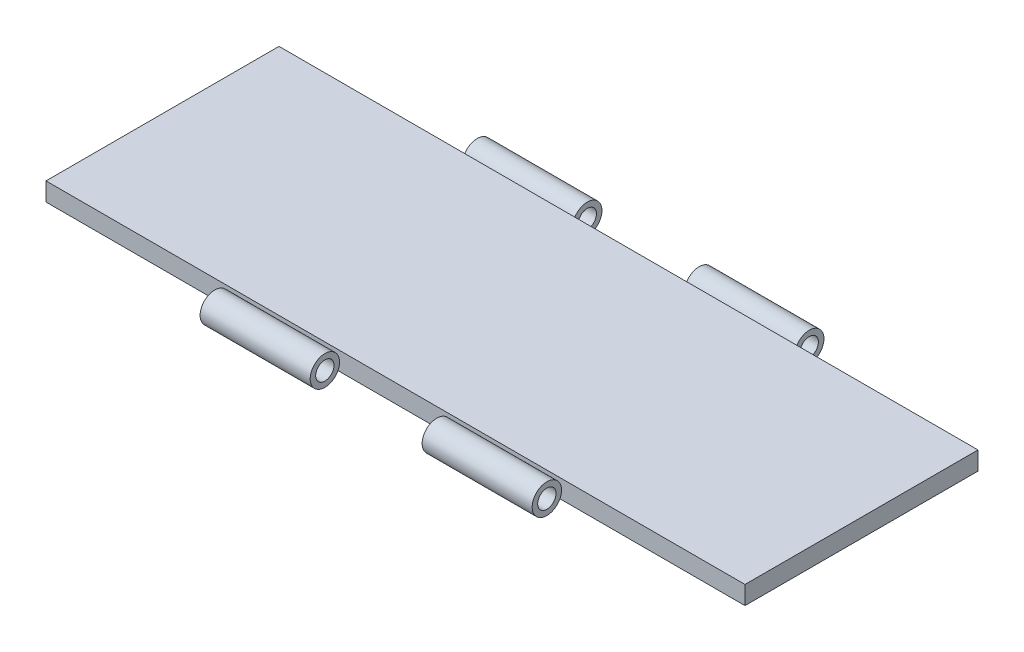
ISO-10303-21;
HEADER;
FILE_DESCRIPTION(('STEP AP214'),'2;1');
FILE_NAME('part.step','',(''),(''),'','','');
FILE_SCHEMA(('AUTOMOTIVE_DESIGN { 1 0 10303 214 1 1 1 1 }'));
ENDSEC;
DATA;
#1=APPLICATION_CONTEXT('core data for automotive mechanical design processes');
#2=APPLICATION_PROTOCOL_DEFINITION('international standard','automotive_design',2000,#1);
#3=PRODUCT_CONTEXT('',#1,'mechanical');
#4=PRODUCT('Part','Part','',(#3));
#5=PRODUCT_RELATED_PRODUCT_CATEGORY('part','',(#4));
#6=PRODUCT_DEFINITION_FORMATION('','',#4);
#7=PRODUCT_DEFINITION_CONTEXT('part definition',#1,'design');
#8=PRODUCT_DEFINITION('design','',#6,#7);
#9=PRODUCT_DEFINITION_SHAPE('','',#8);
#10=(LENGTH_UNIT() NAMED_UNIT(*) SI_UNIT(.MILLI.,.METRE.));
#11=(NAMED_UNIT(*) PLANE_ANGLE_UNIT() SI_UNIT($,.RADIAN.));
#12=(NAMED_UNIT(*) SI_UNIT($,.STERADIAN.) SOLID_ANGLE_UNIT());
#13=UNCERTAINTY_MEASURE_WITH_UNIT(LENGTH_MEASURE(1.E-05),#10,'distance_accuracy_value','');
#14=(GEOMETRIC_REPRESENTATION_CONTEXT(3) GLOBAL_UNCERTAINTY_ASSIGNED_CONTEXT((#13)) GLOBAL_UNIT_ASSIGNED_CONTEXT((#10,
#11,#12)) REPRESENTATION_CONTEXT('',''));
#15=CARTESIAN_POINT('',(0.,0.,0.));
#16=DIRECTION('',(0.,0.,1.));
#17=DIRECTION('',(1.,0.,0.));
#18=AXIS2_PLACEMENT_3D('',#15,#16,#17);
#19=CARTESIAN_POINT('',(40.9284271247462,0.901009784155106,14.3));
#20=DIRECTION('',(-1.,0.,0.));
#21=DIRECTION('',(0.,0.,1.));
#22=AXIS2_PLACEMENT_3D('',#19,#20,#21);
#23=CYLINDRICAL_SURFACE('',#22,1.);
#24=CARTESIAN_POINT('',(6.10000000000004,0.901009784155106,14.3));
#25=DIRECTION('',(1.,0.,0.));
#26=DIRECTION('',(0.,0.,-1.));
#27=AXIS2_PLACEMENT_3D('',#24,#25,#26);
#28=CIRCLE('',#27,1.);
#29=CARTESIAN_POINT('',(6.10000000000004,0.901009784155106,15.3));
#30=VERTEX_POINT('',#29);
#31=EDGE_CURVE('E55',#30,#30,#28,.F.);
#32=CARTESIAN_POINT('',(18.1,0.901009784155106,14.3));
#33=DIRECTION('',(1.,0.,0.));
#34=DIRECTION('',(0.,0.,-1.));
#35=AXIS2_PLACEMENT_3D('',#32,#33,#34);
#36=CIRCLE('',#35,1.);
#37=CARTESIAN_POINT('',(18.1,0.901009784155106,15.3));
#38=VERTEX_POINT('',#37);
#39=EDGE_CURVE('E51',#38,#38,#36,.F.);
#40=CARTESIAN_POINT('',(6.10000000000004,0.901009784155106,15.3));
#41=CARTESIAN_POINT('',(6.22500000000004,0.901009784155106,15.3));
#42=CARTESIAN_POINT('',(6.35000000000004,0.901009784155106,15.3));
#43=CARTESIAN_POINT('',(6.60000000000004,0.901009784155106,15.3));
#44=CARTESIAN_POINT('',(6.72500000000004,0.901009784155106,15.3));
#45=CARTESIAN_POINT('',(6.97500000000004,0.901009784155106,15.3));
#46=CARTESIAN_POINT('',(7.10000000000004,0.901009784155106,15.3));
#47=CARTESIAN_POINT('',(7.35000000000004,0.901009784155106,15.3));
#48=CARTESIAN_POINT('',(7.47500000000004,0.901009784155106,15.3));
#49=CARTESIAN_POINT('',(7.72500000000004,0.901009784155106,15.3));
#50=CARTESIAN_POINT('',(7.85000000000004,0.901009784155106,15.3));
#51=CARTESIAN_POINT('',(8.10000000000004,0.901009784155106,15.3));
#52=CARTESIAN_POINT('',(8.22500000000004,0.901009784155106,15.3));
#53=CARTESIAN_POINT('',(8.47500000000004,0.901009784155106,15.3));
#54=CARTESIAN_POINT('',(8.60000000000004,0.901009784155106,15.3));
#55=CARTESIAN_POINT('',(8.85000000000004,0.901009784155106,15.3));
#56=CARTESIAN_POINT('',(8.97500000000004,0.901009784155106,15.3));
#57=CARTESIAN_POINT('',(9.22500000000004,0.901009784155106,15.3));
#58=CARTESIAN_POINT('',(9.35000000000004,0.901009784155106,15.3));
#59=CARTESIAN_POINT('',(9.60000000000004,0.901009784155106,15.3));
#60=CARTESIAN_POINT('',(9.72500000000004,0.901009784155106,15.3));
#61=CARTESIAN_POINT('',(9.97500000000004,0.901009784155106,15.3));
#62=CARTESIAN_POINT('',(10.1,0.901009784155106,15.3));
#63=CARTESIAN_POINT('',(10.35,0.901009784155106,15.3));
#64=CARTESIAN_POINT('',(10.475,0.901009784155106,15.3));
#65=CARTESIAN_POINT('',(10.725,0.901009784155106,15.3));
#66=CARTESIAN_POINT('',(10.85,0.901009784155106,15.3));
#67=CARTESIAN_POINT('',(11.1,0.901009784155106,15.3));
#68=CARTESIAN_POINT('',(11.225,0.901009784155106,15.3));
#69=CARTESIAN_POINT('',(11.475,0.901009784155106,15.3));
#70=CARTESIAN_POINT('',(11.6,0.901009784155106,15.3));
#71=CARTESIAN_POINT('',(11.85,0.901009784155106,15.3));
#72=CARTESIAN_POINT('',(11.975,0.901009784155106,15.3));
#73=CARTESIAN_POINT('',(12.225,0.901009784155106,15.3));
#74=CARTESIAN_POINT('',(12.35,0.901009784155106,15.3));
#75=CARTESIAN_POINT('',(12.6,0.901009784155106,15.3));
#76=CARTESIAN_POINT('',(12.725,0.901009784155106,15.3));
#77=CARTESIAN_POINT('',(12.975,0.901009784155106,15.3));
#78=CARTESIAN_POINT('',(13.1,0.901009784155106,15.3));
#79=CARTESIAN_POINT('',(13.35,0.901009784155106,15.3));
#80=CARTESIAN_POINT('',(13.475,0.901009784155106,15.3));
#81=CARTESIAN_POINT('',(13.725,0.901009784155106,15.3));
#82=CARTESIAN_POINT('',(13.85,0.901009784155106,15.3));
#83=CARTESIAN_POINT('',(14.1,0.901009784155106,15.3));
#84=CARTESIAN_POINT('',(14.225,0.901009784155106,15.3));
#85=CARTESIAN_POINT('',(14.475,0.901009784155106,15.3));
#86=CARTESIAN_POINT('',(14.6,0.901009784155106,15.3));
#87=CARTESIAN_POINT('',(14.85,0.901009784155106,15.3));
#88=CARTESIAN_POINT('',(14.975,0.901009784155106,15.3));
#89=CARTESIAN_POINT('',(15.225,0.901009784155106,15.3));
#90=CARTESIAN_POINT('',(15.35,0.901009784155106,15.3));
#91=CARTESIAN_POINT('',(15.6,0.901009784155106,15.3));
#92=CARTESIAN_POINT('',(15.725,0.901009784155106,15.3));
#93=CARTESIAN_POINT('',(15.975,0.901009784155106,15.3));
#94=CARTESIAN_POINT('',(16.1,0.901009784155106,15.3));
#95=CARTESIAN_POINT('',(16.35,0.901009784155106,15.3));
#96=CARTESIAN_POINT('',(16.475,0.901009784155106,15.3));
#97=CARTESIAN_POINT('',(16.725,0.901009784155106,15.3));
#98=CARTESIAN_POINT('',(16.85,0.901009784155106,15.3));
#99=CARTESIAN_POINT('',(17.1,0.901009784155106,15.3));
#100=CARTESIAN_POINT('',(17.225,0.901009784155106,15.3));
#101=CARTESIAN_POINT('',(17.475,0.901009784155106,15.3));
#102=CARTESIAN_POINT('',(17.6,0.901009784155106,15.3));
#103=CARTESIAN_POINT('',(17.85,0.901009784155106,15.3));
#104=CARTESIAN_POINT('',(17.975,0.901009784155106,15.3));
#105=CARTESIAN_POINT('',(18.1,0.901009784155106,15.3));
#106=B_SPLINE_CURVE_WITH_KNOTS('',3,(#40,#41,#42,#43,#44,#45,#46,#47,#48,#49,#50,#51,#52,#53,
#54,#55,#56,#57,#58,#59,#60,#61,#62,#63,#64,#65,#66,#67,#68,#69,#70,#71,#72,#73,#74,#75,#76,#77,
#78,#79,#80,#81,#82,#83,#84,#85,#86,#87,#88,#89,#90,#91,#92,#93,#94,#95,#96,#97,#98,#99,#100,
#101,#102,#103,#104,#105),.UNSPECIFIED.,.F.,.F.,(4,2,2,2,2,2,2,2,2,2,2,2,2,2,2,2,2,2,2,2,2,2,2,
2,2,2,2,2,2,2,2,2,4),(0.,0.375,0.750000000000001,1.125,1.5,1.875,2.25,2.625,3.,3.375,
3.74999999999999,4.12499999999999,4.49999999999999,4.87499999999999,5.24999999999999,
5.62499999999999,5.99999999999999,6.37499999999999,6.74999999999999,7.12499999999999,
7.49999999999999,7.87499999999999,8.24999999999999,8.62499999999999,8.99999999999999,
9.37499999999999,9.74999999999999,10.125,10.5,10.875,11.25,11.625,12.),.UNSPECIFIED.);
#107=EDGE_CURVE('BSEAM40',#30,#38,#106,.T.);
#108=ORIENTED_EDGE('',*,*,#31,.T.);
#109=ORIENTED_EDGE('',*,*,#39,.F.);
#110=ORIENTED_EDGE('',*,*,#107,.T.);
#111=ORIENTED_EDGE('',*,*,#107,.F.);
#112=EDGE_LOOP('',(#108,#110,#109,#111));
#113=FACE_BOUND('',#112,.T.);
#114=ADVANCED_FACE('F40',(#113),#23,.F.);
#115=CARTESIAN_POINT('',(18.1,-0.698990215844896,15.9));
#116=DIRECTION('',(1.,0.,0.));
#117=DIRECTION('',(0.,0.,-1.));
#118=AXIS2_PLACEMENT_3D('',#115,#116,#117);
#119=PLANE('',#118);
#120=CARTESIAN_POINT('',(18.1,0.901009784155106,14.3));
#121=DIRECTION('',(1.,0.,0.));
#122=DIRECTION('',(0.,0.,-1.));
#123=AXIS2_PLACEMENT_3D('',#120,#121,#122);
#124=CIRCLE('',#123,1.6);
#125=CARTESIAN_POINT('',(18.1,0.901009784155106,12.7));
#126=VERTEX_POINT('',#125);
#127=EDGE_CURVE('E11',#126,#126,#124,.F.);
#128=ORIENTED_EDGE('',*,*,#127,.F.);
#129=EDGE_LOOP('',(#128));
#130=FACE_BOUND('',#129,.T.);
#131=ORIENTED_EDGE('',*,*,#39,.T.);
#132=EDGE_LOOP('',(#131));
#133=FACE_BOUND('',#132,.T.);
#134=ADVANCED_FACE('F65',(#130,#133),#119,.T.);
#135=CARTESIAN_POINT('',(6.10000000000004,-0.698990215844896,15.9));
#136=DIRECTION('',(1.,0.,0.));
#137=DIRECTION('',(0.,0.,-1.));
#138=AXIS2_PLACEMENT_3D('',#135,#136,#137);
#139=PLANE('',#138);
#140=CARTESIAN_POINT('',(6.10000000000004,0.901009784155106,14.3));
#141=DIRECTION('',(1.,0.,0.));
#142=DIRECTION('',(0.,0.,-1.));
#143=AXIS2_PLACEMENT_3D('',#140,#141,#142);
#144=CIRCLE('',#143,1.6);
#145=CARTESIAN_POINT('',(6.10000000000003,0.901009784155106,12.7));
#146=VERTEX_POINT('',#145);
#147=EDGE_CURVE('E47',#146,#146,#144,.F.);
#148=ORIENTED_EDGE('',*,*,#147,.T.);
#149=EDGE_LOOP('',(#148));
#150=FACE_BOUND('',#149,.T.);
#151=ORIENTED_EDGE('',*,*,#31,.F.);
#152=EDGE_LOOP('',(#151));
#153=FACE_BOUND('',#152,.T.);
#154=ADVANCED_FACE('F63',(#150,#153),#139,.F.);
#155=CARTESIAN_POINT('',(42.6254833995939,0.901009784155106,14.3));
#156=DIRECTION('',(-1.,0.,0.));
#157=DIRECTION('',(0.,0.,1.));
#158=AXIS2_PLACEMENT_3D('',#155,#156,#157);
#159=CYLINDRICAL_SURFACE('',#158,1.6);
#160=ORIENTED_EDGE('',*,*,#147,.F.);
#161=EDGE_LOOP('',(#160));
#162=FACE_BOUND('',#161,.T.);
#163=ORIENTED_EDGE('',*,*,#127,.T.);
#164=EDGE_LOOP('',(#163));
#165=FACE_BOUND('',#164,.T.);
#166=ADVANCED_FACE('F42',(#162,#165),#159,.T.);
#167=CLOSED_SHELL('',(#114,#134,#154,#166));
#168=MANIFOLD_SOLID_BREP('B2',#167);
#169=CARTESIAN_POINT('',(40.9284271247462,0.901009784155106,-14.3061802949504));
#170=DIRECTION('',(-1.,0.,0.));
#171=DIRECTION('',(0.,0.,1.));
#172=AXIS2_PLACEMENT_3D('',#169,#170,#171);
#173=CYLINDRICAL_SURFACE('',#172,1.);
#174=CARTESIAN_POINT('',(6.10000000000004,0.901009784155106,-14.3061802949504));
#175=DIRECTION('',(1.,0.,0.));
#176=DIRECTION('',(0.,0.,-1.));
#177=AXIS2_PLACEMENT_3D('',#174,#175,#176);
#178=CIRCLE('',#177,1.);
#179=CARTESIAN_POINT('',(6.10000000000003,0.901009784155106,-13.3061802949504));
#180=VERTEX_POINT('',#179);
#181=EDGE_CURVE('E125',#180,#180,#178,.F.);
#182=CARTESIAN_POINT('',(18.1,0.901009784155106,-14.3061802949504));
#183=DIRECTION('',(1.,0.,0.));
#184=DIRECTION('',(0.,0.,-1.));
#185=AXIS2_PLACEMENT_3D('',#182,#183,#184);
#186=CIRCLE('',#185,1.);
#187=CARTESIAN_POINT('',(18.1,0.901009784155106,-13.3061802949504));
#188=VERTEX_POINT('',#187);
#189=EDGE_CURVE('E121',#188,#188,#186,.F.);
#190=CARTESIAN_POINT('',(6.10000000000003,0.901009784155106,-13.3061802949504));
#191=CARTESIAN_POINT('',(6.22500000000003,0.901009784155106,-13.3061802949504));
#192=CARTESIAN_POINT('',(6.35000000000003,0.901009784155106,-13.3061802949504));
#193=CARTESIAN_POINT('',(6.60000000000003,0.901009784155106,-13.3061802949504));
#194=CARTESIAN_POINT('',(6.72500000000003,0.901009784155106,-13.3061802949504));
#195=CARTESIAN_POINT('',(6.97500000000003,0.901009784155106,-13.3061802949504));
#196=CARTESIAN_POINT('',(7.10000000000003,0.901009784155106,-13.3061802949504));
#197=CARTESIAN_POINT('',(7.35000000000003,0.901009784155106,-13.3061802949504));
#198=CARTESIAN_POINT('',(7.47500000000003,0.901009784155106,-13.3061802949504));
#199=CARTESIAN_POINT('',(7.72500000000003,0.901009784155106,-13.3061802949504));
#200=CARTESIAN_POINT('',(7.85000000000003,0.901009784155106,-13.3061802949504));
#201=CARTESIAN_POINT('',(8.10000000000003,0.901009784155106,-13.3061802949504));
#202=CARTESIAN_POINT('',(8.22500000000003,0.901009784155106,-13.3061802949504));
#203=CARTESIAN_POINT('',(8.47500000000003,0.901009784155106,-13.3061802949504));
#204=CARTESIAN_POINT('',(8.60000000000003,0.901009784155106,-13.3061802949504));
#205=CARTESIAN_POINT('',(8.85000000000003,0.901009784155106,-13.3061802949504));
#206=CARTESIAN_POINT('',(8.97500000000003,0.901009784155106,-13.3061802949504));
#207=CARTESIAN_POINT('',(9.22500000000003,0.901009784155106,-13.3061802949504));
#208=CARTESIAN_POINT('',(9.35000000000003,0.901009784155106,-13.3061802949504));
#209=CARTESIAN_POINT('',(9.60000000000003,0.901009784155106,-13.3061802949504));
#210=CARTESIAN_POINT('',(9.72500000000003,0.901009784155106,-13.3061802949504));
#211=CARTESIAN_POINT('',(9.97500000000003,0.901009784155106,-13.3061802949504));
#212=CARTESIAN_POINT('',(10.1,0.901009784155106,-13.3061802949504));
#213=CARTESIAN_POINT('',(10.35,0.901009784155106,-13.3061802949504));
#214=CARTESIAN_POINT('',(10.475,0.901009784155106,-13.3061802949504));
#215=CARTESIAN_POINT('',(10.725,0.901009784155106,-13.3061802949504));
#216=CARTESIAN_POINT('',(10.85,0.901009784155106,-13.3061802949504));
#217=CARTESIAN_POINT('',(11.1,0.901009784155106,-13.3061802949504));
#218=CARTESIAN_POINT('',(11.225,0.901009784155106,-13.3061802949504));
#219=CARTESIAN_POINT('',(11.475,0.901009784155106,-13.3061802949504));
#220=CARTESIAN_POINT('',(11.6,0.901009784155106,-13.3061802949504));
#221=CARTESIAN_POINT('',(11.85,0.901009784155106,-13.3061802949504));
#222=CARTESIAN_POINT('',(11.975,0.901009784155106,-13.3061802949504));
#223=CARTESIAN_POINT('',(12.225,0.901009784155106,-13.3061802949504));
#224=CARTESIAN_POINT('',(12.35,0.901009784155106,-13.3061802949504));
#225=CARTESIAN_POINT('',(12.6,0.901009784155106,-13.3061802949504));
#226=CARTESIAN_POINT('',(12.725,0.901009784155106,-13.3061802949504));
#227=CARTESIAN_POINT('',(12.975,0.901009784155106,-13.3061802949504));
#228=CARTESIAN_POINT('',(13.1,0.901009784155106,-13.3061802949504));
#229=CARTESIAN_POINT('',(13.35,0.901009784155106,-13.3061802949504));
#230=CARTESIAN_POINT('',(13.475,0.901009784155106,-13.3061802949504));
#231=CARTESIAN_POINT('',(13.725,0.901009784155106,-13.3061802949504));
#232=CARTESIAN_POINT('',(13.85,0.901009784155106,-13.3061802949504));
#233=CARTESIAN_POINT('',(14.1,0.901009784155106,-13.3061802949504));
#234=CARTESIAN_POINT('',(14.225,0.901009784155106,-13.3061802949504));
#235=CARTESIAN_POINT('',(14.475,0.901009784155106,-13.3061802949504));
#236=CARTESIAN_POINT('',(14.6,0.901009784155106,-13.3061802949504));
#237=CARTESIAN_POINT('',(14.85,0.901009784155106,-13.3061802949504));
#238=CARTESIAN_POINT('',(14.975,0.901009784155106,-13.3061802949504));
#239=CARTESIAN_POINT('',(15.225,0.901009784155106,-13.3061802949504));
#240=CARTESIAN_POINT('',(15.35,0.901009784155106,-13.3061802949504));
#241=CARTESIAN_POINT('',(15.6,0.901009784155106,-13.3061802949504));
#242=CARTESIAN_POINT('',(15.725,0.901009784155106,-13.3061802949504));
#243=CARTESIAN_POINT('',(15.975,0.901009784155106,-13.3061802949504));
#244=CARTESIAN_POINT('',(16.1,0.901009784155106,-13.3061802949504));
#245=CARTESIAN_POINT('',(16.35,0.901009784155106,-13.3061802949504));
#246=CARTESIAN_POINT('',(16.475,0.901009784155106,-13.3061802949504));
#247=CARTESIAN_POINT('',(16.725,0.901009784155106,-13.3061802949504));
#248=CARTESIAN_POINT('',(16.85,0.901009784155106,-13.3061802949504));
#249=CARTESIAN_POINT('',(17.1,0.901009784155106,-13.3061802949504));
#250=CARTESIAN_POINT('',(17.225,0.901009784155106,-13.3061802949504));
#251=CARTESIAN_POINT('',(17.475,0.901009784155106,-13.3061802949504));
#252=CARTESIAN_POINT('',(17.6,0.901009784155106,-13.3061802949504));
#253=CARTESIAN_POINT('',(17.85,0.901009784155106,-13.3061802949504));
#254=CARTESIAN_POINT('',(17.975,0.901009784155106,-13.3061802949504));
#255=CARTESIAN_POINT('',(18.1,0.901009784155106,-13.3061802949504));
#256=B_SPLINE_CURVE_WITH_KNOTS('',3,(#190,#191,#192,#193,#194,#195,#196,#197,#198,#199,#200,
#201,#202,#203,#204,#205,#206,#207,#208,#209,#210,#211,#212,#213,#214,#215,#216,#217,#218,#219,
#220,#221,#222,#223,#224,#225,#226,#227,#228,#229,#230,#231,#232,#233,#234,#235,#236,#237,#238,
#239,#240,#241,#242,#243,#244,#245,#246,#247,#248,#249,#250,#251,#252,#253,#254,#255),
.UNSPECIFIED.,.F.,.F.,(4,2,2,2,2,2,2,2,2,2,2,2,2,2,2,2,2,2,2,2,2,2,2,2,2,2,2,2,2,2,2,2,4),(0.,
0.375,0.750000000000001,1.125,1.5,1.875,2.25,2.625,3.,3.375,3.75,4.125,4.5,4.875,5.25,5.625,6.,
6.375,6.75,7.125,7.5,7.875,8.25,8.625,9.,9.375,9.75,10.125,10.5,10.875,11.25,11.625,12.),.UNSPECIFIED.);
#257=EDGE_CURVE('BSEAM110',#180,#188,#256,.T.);
#258=ORIENTED_EDGE('',*,*,#181,.T.);
#259=ORIENTED_EDGE('',*,*,#189,.F.);
#260=ORIENTED_EDGE('',*,*,#257,.T.);
#261=ORIENTED_EDGE('',*,*,#257,.F.);
#262=EDGE_LOOP('',(#258,#260,#259,#261));
#263=FACE_BOUND('',#262,.T.);
#264=ADVANCED_FACE('F110',(#263),#173,.F.);
#265=CARTESIAN_POINT('',(18.1,-0.698990215844896,-12.7061802949504));
#266=DIRECTION('',(1.,0.,0.));
#267=DIRECTION('',(0.,0.,-1.));
#268=AXIS2_PLACEMENT_3D('',#265,#266,#267);
#269=PLANE('',#268);
#270=CARTESIAN_POINT('',(18.1,0.901009784155106,-14.3061802949504));
#271=DIRECTION('',(1.,0.,0.));
#272=DIRECTION('',(0.,0.,-1.));
#273=AXIS2_PLACEMENT_3D('',#270,#271,#272);
#274=CIRCLE('',#273,1.6);
#275=CARTESIAN_POINT('',(18.1,0.901009784155106,-15.9061802949504));
#276=VERTEX_POINT('',#275);
#277=EDGE_CURVE('E39',#276,#276,#274,.F.);
#278=ORIENTED_EDGE('',*,*,#277,.F.);
#279=EDGE_LOOP('',(#278));
#280=FACE_BOUND('',#279,.T.);
#281=ORIENTED_EDGE('',*,*,#189,.T.);
#282=EDGE_LOOP('',(#281));
#283=FACE_BOUND('',#282,.T.);
#284=ADVANCED_FACE('F135',(#280,#283),#269,.T.);
#285=CARTESIAN_POINT('',(6.10000000000004,-0.698990215844896,-12.7061802949504));
#286=DIRECTION('',(1.,0.,0.));
#287=DIRECTION('',(0.,0.,-1.));
#288=AXIS2_PLACEMENT_3D('',#285,#286,#287);
#289=PLANE('',#288);
#290=CARTESIAN_POINT('',(6.10000000000004,0.901009784155106,-14.3061802949504));
#291=DIRECTION('',(1.,0.,0.));
#292=DIRECTION('',(0.,0.,-1.));
#293=AXIS2_PLACEMENT_3D('',#290,#291,#292);
#294=CIRCLE('',#293,1.6);
#295=CARTESIAN_POINT('',(6.10000000000004,0.901009784155106,-15.9061802949504));
#296=VERTEX_POINT('',#295);
#297=EDGE_CURVE('E117',#296,#296,#294,.F.);
#298=ORIENTED_EDGE('',*,*,#297,.T.);
#299=EDGE_LOOP('',(#298));
#300=FACE_BOUND('',#299,.T.);
#301=ORIENTED_EDGE('',*,*,#181,.F.);
#302=EDGE_LOOP('',(#301));
#303=FACE_BOUND('',#302,.T.);
#304=ADVANCED_FACE('F133',(#300,#303),#289,.F.);
#305=CARTESIAN_POINT('',(42.6254833995939,0.901009784155106,-14.3061802949504));
#306=DIRECTION('',(-1.,0.,0.));
#307=DIRECTION('',(0.,0.,1.));
#308=AXIS2_PLACEMENT_3D('',#305,#306,#307);
#309=CYLINDRICAL_SURFACE('',#308,1.6);
#310=ORIENTED_EDGE('',*,*,#297,.F.);
#311=EDGE_LOOP('',(#310));
#312=FACE_BOUND('',#311,.T.);
#313=ORIENTED_EDGE('',*,*,#277,.T.);
#314=EDGE_LOOP('',(#313));
#315=FACE_BOUND('',#314,.T.);
#316=ADVANCED_FACE('F112',(#312,#315),#309,.T.);
#317=CLOSED_SHELL('',(#264,#284,#304,#316));
#318=MANIFOLD_SOLID_BREP('B6',#317);
#319=CARTESIAN_POINT('',(40.9284271247462,0.901009784155106,14.3));
#320=DIRECTION('',(-1.,0.,0.));
#321=DIRECTION('',(0.,0.,1.));
#322=AXIS2_PLACEMENT_3D('',#319,#320,#321);
#323=CYLINDRICAL_SURFACE('',#322,1.);
#324=CARTESIAN_POINT('',(-18.1,0.901009784155106,14.3));
#325=DIRECTION('',(1.,0.,0.));
#326=DIRECTION('',(0.,0.,-1.));
#327=AXIS2_PLACEMENT_3D('',#324,#325,#326);
#328=CIRCLE('',#327,1.);
#329=CARTESIAN_POINT('',(-18.1,0.901009784155106,15.3));
#330=VERTEX_POINT('',#329);
#331=EDGE_CURVE('E194',#330,#330,#328,.F.);
#332=CARTESIAN_POINT('',(-6.10000000000001,0.901009784155106,14.3));
#333=DIRECTION('',(1.,0.,0.));
#334=DIRECTION('',(0.,0.,-1.));
#335=AXIS2_PLACEMENT_3D('',#332,#333,#334);
#336=CIRCLE('',#335,1.);
#337=CARTESIAN_POINT('',(-6.10000000000003,0.901009784155106,15.3));
#338=VERTEX_POINT('',#337);
#339=EDGE_CURVE('E184',#338,#338,#336,.F.);
#340=CARTESIAN_POINT('',(-18.1,0.901009784155106,15.3));
#341=CARTESIAN_POINT('',(-17.975,0.901009784155106,15.3));
#342=CARTESIAN_POINT('',(-17.85,0.901009784155106,15.3));
#343=CARTESIAN_POINT('',(-17.6,0.901009784155106,15.3));
#344=CARTESIAN_POINT('',(-17.475,0.901009784155106,15.3));
#345=CARTESIAN_POINT('',(-17.225,0.901009784155106,15.3));
#346=CARTESIAN_POINT('',(-17.1,0.901009784155106,15.3));
#347=CARTESIAN_POINT('',(-16.85,0.901009784155106,15.3));
#348=CARTESIAN_POINT('',(-16.725,0.901009784155106,15.3));
#349=CARTESIAN_POINT('',(-16.475,0.901009784155106,15.3));
#350=CARTESIAN_POINT('',(-16.35,0.901009784155106,15.3));
#351=CARTESIAN_POINT('',(-16.1,0.901009784155106,15.3));
#352=CARTESIAN_POINT('',(-15.975,0.901009784155106,15.3));
#353=CARTESIAN_POINT('',(-15.725,0.901009784155106,15.3));
#354=CARTESIAN_POINT('',(-15.6,0.901009784155106,15.3));
#355=CARTESIAN_POINT('',(-15.35,0.901009784155106,15.3));
#356=CARTESIAN_POINT('',(-15.225,0.901009784155106,15.3));
#357=CARTESIAN_POINT('',(-14.975,0.901009784155106,15.3));
#358=CARTESIAN_POINT('',(-14.85,0.901009784155106,15.3));
#359=CARTESIAN_POINT('',(-14.6,0.901009784155106,15.3));
#360=CARTESIAN_POINT('',(-14.475,0.901009784155106,15.3));
#361=CARTESIAN_POINT('',(-14.225,0.901009784155106,15.3));
#362=CARTESIAN_POINT('',(-14.1,0.901009784155106,15.3));
#363=CARTESIAN_POINT('',(-13.85,0.901009784155106,15.3));
#364=CARTESIAN_POINT('',(-13.725,0.901009784155106,15.3));
#365=CARTESIAN_POINT('',(-13.475,0.901009784155106,15.3));
#366=CARTESIAN_POINT('',(-13.35,0.901009784155106,15.3));
#367=CARTESIAN_POINT('',(-13.1,0.901009784155106,15.3));
#368=CARTESIAN_POINT('',(-12.975,0.901009784155106,15.3));
#369=CARTESIAN_POINT('',(-12.725,0.901009784155106,15.3));
#370=CARTESIAN_POINT('',(-12.6,0.901009784155106,15.3));
#371=CARTESIAN_POINT('',(-12.35,0.901009784155106,15.3));
#372=CARTESIAN_POINT('',(-12.225,0.901009784155106,15.3));
#373=CARTESIAN_POINT('',(-11.975,0.901009784155106,15.3));
#374=CARTESIAN_POINT('',(-11.85,0.901009784155106,15.3));
#375=CARTESIAN_POINT('',(-11.6,0.901009784155106,15.3));
#376=CARTESIAN_POINT('',(-11.475,0.901009784155106,15.3));
#377=CARTESIAN_POINT('',(-11.225,0.901009784155106,15.3));
#378=CARTESIAN_POINT('',(-11.1,0.901009784155106,15.3));
#379=CARTESIAN_POINT('',(-10.85,0.901009784155106,15.3));
#380=CARTESIAN_POINT('',(-10.725,0.901009784155106,15.3));
#381=CARTESIAN_POINT('',(-10.475,0.901009784155106,15.3));
#382=CARTESIAN_POINT('',(-10.35,0.901009784155106,15.3));
#383=CARTESIAN_POINT('',(-10.1,0.901009784155106,15.3));
#384=CARTESIAN_POINT('',(-9.975,0.901009784155106,15.3));
#385=CARTESIAN_POINT('',(-9.725,0.901009784155106,15.3));
#386=CARTESIAN_POINT('',(-9.6,0.901009784155106,15.3));
#387=CARTESIAN_POINT('',(-9.35000000000001,0.901009784155106,15.3));
#388=CARTESIAN_POINT('',(-9.22500000000001,0.901009784155106,15.3));
#389=CARTESIAN_POINT('',(-8.97500000000001,0.901009784155106,15.3));
#390=CARTESIAN_POINT('',(-8.85000000000002,0.901009784155106,15.3));
#391=CARTESIAN_POINT('',(-8.60000000000002,0.901009784155106,15.3));
#392=CARTESIAN_POINT('',(-8.47500000000002,0.901009784155106,15.3));
#393=CARTESIAN_POINT('',(-8.22500000000002,0.901009784155106,15.3));
#394=CARTESIAN_POINT('',(-8.10000000000002,0.901009784155106,15.3));
#395=CARTESIAN_POINT('',(-7.85000000000002,0.901009784155106,15.3));
#396=CARTESIAN_POINT('',(-7.72500000000002,0.901009784155106,15.3));
#397=CARTESIAN_POINT('',(-7.47500000000002,0.901009784155106,15.3));
#398=CARTESIAN_POINT('',(-7.35000000000002,0.901009784155106,15.3));
#399=CARTESIAN_POINT('',(-7.10000000000002,0.901009784155106,15.3));
#400=CARTESIAN_POINT('',(-6.97500000000002,0.901009784155106,15.3));
#401=CARTESIAN_POINT('',(-6.72500000000003,0.901009784155106,15.3));
#402=CARTESIAN_POINT('',(-6.60000000000003,0.901009784155106,15.3));
#403=CARTESIAN_POINT('',(-6.35000000000003,0.901009784155106,15.3));
#404=CARTESIAN_POINT('',(-6.22500000000003,0.901009784155106,15.3));
#405=CARTESIAN_POINT('',(-6.10000000000003,0.901009784155106,15.3));
#406=B_SPLINE_CURVE_WITH_KNOTS('',3,(#340,#341,#342,#343,#344,#345,#346,#347,#348,#349,#350,
#351,#352,#353,#354,#355,#356,#357,#358,#359,#360,#361,#362,#363,#364,#365,#366,#367,#368,#369,
#370,#371,#372,#373,#374,#375,#376,#377,#378,#379,#380,#381,#382,#383,#384,#385,#386,#387,#388,
#389,#390,#391,#392,#393,#394,#395,#396,#397,#398,#399,#400,#401,#402,#403,#404,#405),
.UNSPECIFIED.,.F.,.F.,(4,2,2,2,2,2,2,2,2,2,2,2,2,2,2,2,2,2,2,2,2,2,2,2,2,2,2,2,2,2,2,2,4),(0.,
0.375,0.749999999999994,1.12499999999999,1.49999999999999,1.87499999999999,2.24999999999999,
2.62499999999998,2.99999999999998,3.37499999999998,3.74999999999998,4.12499999999998,
4.49999999999998,4.87499999999997,5.24999999999997,5.62499999999996,5.99999999999996,
6.37499999999996,6.74999999999996,7.12499999999996,7.49999999999995,7.87499999999995,
8.24999999999995,8.62499999999995,8.99999999999994,9.37499999999994,9.74999999999994,
10.1249999999999,10.4999999999999,10.8749999999999,11.2499999999999,11.6249999999999,
11.9999999999999),.UNSPECIFIED.);
#407=EDGE_CURVE('BSEAM180',#330,#338,#406,.T.);
#408=ORIENTED_EDGE('',*,*,#331,.T.);
#409=ORIENTED_EDGE('',*,*,#339,.F.);
#410=ORIENTED_EDGE('',*,*,#407,.T.);
#411=ORIENTED_EDGE('',*,*,#407,.F.);
#412=EDGE_LOOP('',(#408,#410,#409,#411));
#413=FACE_BOUND('',#412,.T.);
#414=ADVANCED_FACE('F180',(#413),#323,.F.);
#415=CARTESIAN_POINT('',(-18.1,-0.698990215844896,15.9));
#416=DIRECTION('',(1.,0.,0.));
#417=DIRECTION('',(0.,0.,-1.));
#418=AXIS2_PLACEMENT_3D('',#415,#416,#417);
#419=PLANE('',#418);
#420=CARTESIAN_POINT('',(-18.1,0.901009784155106,14.3));
#421=DIRECTION('',(1.,0.,0.));
#422=DIRECTION('',(0.,0.,-1.));
#423=AXIS2_PLACEMENT_3D('',#420,#421,#422);
#424=CIRCLE('',#423,1.6);
#425=CARTESIAN_POINT('',(-18.1,0.901009784155106,12.7));
#426=VERTEX_POINT('',#425);
#427=EDGE_CURVE('E192',#426,#426,#424,.F.);
#428=ORIENTED_EDGE('',*,*,#427,.T.);
#429=EDGE_LOOP('',(#428));
#430=FACE_BOUND('',#429,.T.);
#431=ORIENTED_EDGE('',*,*,#331,.F.);
#432=EDGE_LOOP('',(#431));
#433=FACE_BOUND('',#432,.T.);
#434=ADVANCED_FACE('F201',(#430,#433),#419,.F.);
#435=CARTESIAN_POINT('',(-6.10000000000004,-0.698990215844896,15.9));
#436=DIRECTION('',(1.,0.,0.));
#437=DIRECTION('',(0.,0.,-1.));
#438=AXIS2_PLACEMENT_3D('',#435,#436,#437);
#439=PLANE('',#438);
#440=CARTESIAN_POINT('',(-6.10000000000001,0.901009784155106,14.3));
#441=DIRECTION('',(1.,0.,0.));
#442=DIRECTION('',(0.,0.,-1.));
#443=AXIS2_PLACEMENT_3D('',#440,#441,#442);
#444=CIRCLE('',#443,1.6);
#445=CARTESIAN_POINT('',(-6.09999999999999,0.901009784155106,12.7));
#446=VERTEX_POINT('',#445);
#447=EDGE_CURVE('E109',#446,#446,#444,.F.);
#448=ORIENTED_EDGE('',*,*,#447,.F.);
#449=EDGE_LOOP('',(#448));
#450=FACE_BOUND('',#449,.T.);
#451=ORIENTED_EDGE('',*,*,#339,.T.);
#452=EDGE_LOOP('',(#451));
#453=FACE_BOUND('',#452,.T.);
#454=ADVANCED_FACE('F205',(#450,#453),#439,.T.);
#455=CARTESIAN_POINT('',(42.6254833995939,0.901009784155106,14.3));
#456=DIRECTION('',(-1.,0.,0.));
#457=DIRECTION('',(0.,0.,1.));
#458=AXIS2_PLACEMENT_3D('',#455,#456,#457);
#459=CYLINDRICAL_SURFACE('',#458,1.6);
#460=ORIENTED_EDGE('',*,*,#427,.F.);
#461=EDGE_LOOP('',(#460));
#462=FACE_BOUND('',#461,.T.);
#463=ORIENTED_EDGE('',*,*,#447,.T.);
#464=EDGE_LOOP('',(#463));
#465=FACE_BOUND('',#464,.T.);
#466=ADVANCED_FACE('F182',(#462,#465),#459,.T.);
#467=CLOSED_SHELL('',(#414,#434,#454,#466));
#468=MANIFOLD_SOLID_BREP('B34',#467);
#469=CARTESIAN_POINT('',(40.9284271247462,0.901009784155106,-14.3061802949504));
#470=DIRECTION('',(-1.,0.,0.));
#471=DIRECTION('',(0.,0.,1.));
#472=AXIS2_PLACEMENT_3D('',#469,#470,#471);
#473=CYLINDRICAL_SURFACE('',#472,1.);
#474=CARTESIAN_POINT('',(-6.10000000000004,0.901009784155106,-14.3061802949504));
#475=DIRECTION('',(1.,0.,0.));
#476=DIRECTION('',(0.,0.,-1.));
#477=AXIS2_PLACEMENT_3D('',#474,#475,#476);
#478=CIRCLE('',#477,1.);
#479=CARTESIAN_POINT('',(-6.10000000000004,0.901009784155106,-13.3061802949504));
#480=VERTEX_POINT('',#479);
#481=EDGE_CURVE('E265',#480,#480,#478,.F.);
#482=CARTESIAN_POINT('',(-18.1,0.901009784155106,-14.3061802949504));
#483=DIRECTION('',(-1.,0.,0.));
#484=DIRECTION('',(0.,0.,1.));
#485=AXIS2_PLACEMENT_3D('',#482,#483,#484);
#486=CIRCLE('',#485,1.);
#487=CARTESIAN_POINT('',(-18.1,0.901009784155106,-13.3061802949504));
#488=VERTEX_POINT('',#487);
#489=EDGE_CURVE('E255',#488,#488,#486,.F.);
#490=CARTESIAN_POINT('',(-6.10000000000004,0.901009784155106,-13.3061802949504));
#491=CARTESIAN_POINT('',(-6.22500000000004,0.901009784155106,-13.3061802949504));
#492=CARTESIAN_POINT('',(-6.35000000000004,0.901009784155106,-13.3061802949504));
#493=CARTESIAN_POINT('',(-6.60000000000004,0.901009784155106,-13.3061802949504));
#494=CARTESIAN_POINT('',(-6.72500000000004,0.901009784155106,-13.3061802949504));
#495=CARTESIAN_POINT('',(-6.97500000000004,0.901009784155106,-13.3061802949504));
#496=CARTESIAN_POINT('',(-7.10000000000004,0.901009784155106,-13.3061802949504));
#497=CARTESIAN_POINT('',(-7.35000000000003,0.901009784155106,-13.3061802949504));
#498=CARTESIAN_POINT('',(-7.47500000000003,0.901009784155106,-13.3061802949504));
#499=CARTESIAN_POINT('',(-7.72500000000003,0.901009784155106,-13.3061802949504));
#500=CARTESIAN_POINT('',(-7.85000000000003,0.901009784155106,-13.3061802949504));
#501=CARTESIAN_POINT('',(-8.10000000000003,0.901009784155106,-13.3061802949504));
#502=CARTESIAN_POINT('',(-8.22500000000003,0.901009784155106,-13.3061802949504));
#503=CARTESIAN_POINT('',(-8.47500000000002,0.901009784155106,-13.3061802949504));
#504=CARTESIAN_POINT('',(-8.60000000000002,0.901009784155106,-13.3061802949504));
#505=CARTESIAN_POINT('',(-8.85000000000002,0.901009784155106,-13.3061802949504));
#506=CARTESIAN_POINT('',(-8.97500000000002,0.901009784155106,-13.3061802949504));
#507=CARTESIAN_POINT('',(-9.22500000000002,0.901009784155106,-13.3061802949504));
#508=CARTESIAN_POINT('',(-9.35000000000002,0.901009784155106,-13.3061802949504));
#509=CARTESIAN_POINT('',(-9.60000000000002,0.901009784155106,-13.3061802949504));
#510=CARTESIAN_POINT('',(-9.72500000000002,0.901009784155106,-13.3061802949504));
#511=CARTESIAN_POINT('',(-9.97500000000002,0.901009784155106,-13.3061802949504));
#512=CARTESIAN_POINT('',(-10.1,0.901009784155106,-13.3061802949504));
#513=CARTESIAN_POINT('',(-10.35,0.901009784155106,-13.3061802949504));
#514=CARTESIAN_POINT('',(-10.475,0.901009784155106,-13.3061802949504));
#515=CARTESIAN_POINT('',(-10.725,0.901009784155106,-13.3061802949504));
#516=CARTESIAN_POINT('',(-10.85,0.901009784155106,-13.3061802949504));
#517=CARTESIAN_POINT('',(-11.1,0.901009784155106,-13.3061802949504));
#518=CARTESIAN_POINT('',(-11.225,0.901009784155106,-13.3061802949504));
#519=CARTESIAN_POINT('',(-11.475,0.901009784155106,-13.3061802949504));
#520=CARTESIAN_POINT('',(-11.6,0.901009784155106,-13.3061802949504));
#521=CARTESIAN_POINT('',(-11.85,0.901009784155106,-13.3061802949504));
#522=CARTESIAN_POINT('',(-11.975,0.901009784155106,-13.3061802949504));
#523=CARTESIAN_POINT('',(-12.225,0.901009784155106,-13.3061802949504));
#524=CARTESIAN_POINT('',(-12.35,0.901009784155106,-13.3061802949504));
#525=CARTESIAN_POINT('',(-12.6,0.901009784155106,-13.3061802949504));
#526=CARTESIAN_POINT('',(-12.725,0.901009784155106,-13.3061802949504));
#527=CARTESIAN_POINT('',(-12.975,0.901009784155106,-13.3061802949504));
#528=CARTESIAN_POINT('',(-13.1,0.901009784155106,-13.3061802949504));
#529=CARTESIAN_POINT('',(-13.35,0.901009784155106,-13.3061802949504));
#530=CARTESIAN_POINT('',(-13.475,0.901009784155106,-13.3061802949504));
#531=CARTESIAN_POINT('',(-13.725,0.901009784155106,-13.3061802949504));
#532=CARTESIAN_POINT('',(-13.85,0.901009784155106,-13.3061802949504));
#533=CARTESIAN_POINT('',(-14.1,0.901009784155106,-13.3061802949504));
#534=CARTESIAN_POINT('',(-14.225,0.901009784155106,-13.3061802949504));
#535=CARTESIAN_POINT('',(-14.475,0.901009784155106,-13.3061802949504));
#536=CARTESIAN_POINT('',(-14.6,0.901009784155106,-13.3061802949504));
#537=CARTESIAN_POINT('',(-14.85,0.901009784155106,-13.3061802949504));
#538=CARTESIAN_POINT('',(-14.975,0.901009784155106,-13.3061802949504));
#539=CARTESIAN_POINT('',(-15.225,0.901009784155106,-13.3061802949504));
#540=CARTESIAN_POINT('',(-15.35,0.901009784155106,-13.3061802949504));
#541=CARTESIAN_POINT('',(-15.6,0.901009784155106,-13.3061802949504));
#542=CARTESIAN_POINT('',(-15.725,0.901009784155106,-13.3061802949504));
#543=CARTESIAN_POINT('',(-15.975,0.901009784155106,-13.3061802949504));
#544=CARTESIAN_POINT('',(-16.1,0.901009784155106,-13.3061802949504));
#545=CARTESIAN_POINT('',(-16.35,0.901009784155106,-13.3061802949504));
#546=CARTESIAN_POINT('',(-16.475,0.901009784155106,-13.3061802949504));
#547=CARTESIAN_POINT('',(-16.725,0.901009784155106,-13.3061802949504));
#548=CARTESIAN_POINT('',(-16.85,0.901009784155106,-13.3061802949504));
#549=CARTESIAN_POINT('',(-17.1,0.901009784155106,-13.3061802949504));
#550=CARTESIAN_POINT('',(-17.225,0.901009784155106,-13.3061802949504));
#551=CARTESIAN_POINT('',(-17.475,0.901009784155106,-13.3061802949504));
#552=CARTESIAN_POINT('',(-17.6,0.901009784155106,-13.3061802949504));
#553=CARTESIAN_POINT('',(-17.85,0.901009784155106,-13.3061802949504));
#554=CARTESIAN_POINT('',(-17.975,0.901009784155106,-13.3061802949504));
#555=CARTESIAN_POINT('',(-18.1,0.901009784155106,-13.3061802949504));
#556=B_SPLINE_CURVE_WITH_KNOTS('',3,(#490,#491,#492,#493,#494,#495,#496,#497,#498,#499,#500,
#501,#502,#503,#504,#505,#506,#507,#508,#509,#510,#511,#512,#513,#514,#515,#516,#517,#518,#519,
#520,#521,#522,#523,#524,#525,#526,#527,#528,#529,#530,#531,#532,#533,#534,#535,#536,#537,#538,
#539,#540,#541,#542,#543,#544,#545,#546,#547,#548,#549,#550,#551,#552,#553,#554,#555),
.UNSPECIFIED.,.F.,.F.,(4,2,2,2,2,2,2,2,2,2,2,2,2,2,2,2,2,2,2,2,2,2,2,2,2,2,2,2,2,2,2,2,4),(0.,
0.375,0.749999999999994,1.12499999999999,1.49999999999999,1.87499999999999,2.24999999999998,
2.62499999999998,2.99999999999998,3.37499999999998,3.74999999999998,4.12499999999997,
4.49999999999997,4.87499999999996,5.24999999999996,5.62499999999996,5.99999999999996,
6.37499999999995,6.74999999999995,7.12499999999995,7.49999999999994,7.87499999999994,
8.24999999999994,8.62499999999994,8.99999999999994,9.37499999999993,9.74999999999993,
10.1249999999999,10.4999999999999,10.8749999999999,11.2499999999999,11.6249999999999,
11.9999999999999),.UNSPECIFIED.);
#557=EDGE_CURVE('BSEAM251',#480,#488,#556,.T.);
#558=ORIENTED_EDGE('',*,*,#481,.F.);
#559=ORIENTED_EDGE('',*,*,#489,.F.);
#560=ORIENTED_EDGE('',*,*,#557,.T.);
#561=ORIENTED_EDGE('',*,*,#557,.F.);
#562=EDGE_LOOP('',(#558,#560,#559,#561));
#563=FACE_BOUND('',#562,.T.);
#564=ADVANCED_FACE('F251',(#563),#473,.F.);
#565=CARTESIAN_POINT('',(-6.10000000000004,-0.698990215844896,-12.7061802949504));
#566=DIRECTION('',(1.,0.,0.));
#567=DIRECTION('',(0.,0.,-1.));
#568=AXIS2_PLACEMENT_3D('',#565,#566,#567);
#569=PLANE('',#568);
#570=CARTESIAN_POINT('',(-6.10000000000004,0.901009784155106,-14.3061802949504));
#571=DIRECTION('',(1.,0.,0.));
#572=DIRECTION('',(0.,0.,-1.));
#573=AXIS2_PLACEMENT_3D('',#570,#571,#572);
#574=CIRCLE('',#573,1.6);
#575=CARTESIAN_POINT('',(-6.10000000000004,0.901009784155106,-15.9061802949504));
#576=VERTEX_POINT('',#575);
#577=EDGE_CURVE('E263',#576,#576,#574,.F.);
#578=ORIENTED_EDGE('',*,*,#577,.F.);
#579=EDGE_LOOP('',(#578));
#580=FACE_BOUND('',#579,.T.);
#581=ORIENTED_EDGE('',*,*,#481,.T.);
#582=EDGE_LOOP('',(#581));
#583=FACE_BOUND('',#582,.T.);
#584=ADVANCED_FACE('F273',(#580,#583),#569,.T.);
#585=CARTESIAN_POINT('',(-18.1,-0.698990215844896,-15.9123605899008));
#586=DIRECTION('',(-1.,0.,0.));
#587=DIRECTION('',(0.,0.,1.));
#588=AXIS2_PLACEMENT_3D('',#585,#586,#587);
#589=PLANE('',#588);
#590=CARTESIAN_POINT('',(-18.1,0.901009784155106,-14.3061802949504));
#591=DIRECTION('',(-1.,0.,0.));
#592=DIRECTION('',(0.,0.,1.));
#593=AXIS2_PLACEMENT_3D('',#590,#591,#592);
#594=CIRCLE('',#593,1.6);
#595=CARTESIAN_POINT('',(-18.1,0.901009784155106,-12.7061802949504));
#596=VERTEX_POINT('',#595);
#597=EDGE_CURVE('E179',#596,#596,#594,.F.);
#598=ORIENTED_EDGE('',*,*,#597,.F.);
#599=EDGE_LOOP('',(#598));
#600=FACE_BOUND('',#599,.T.);
#601=ORIENTED_EDGE('',*,*,#489,.T.);
#602=EDGE_LOOP('',(#601));
#603=FACE_BOUND('',#602,.T.);
#604=ADVANCED_FACE('F275',(#600,#603),#589,.T.);
#605=CARTESIAN_POINT('',(42.6254833995939,0.901009784155106,-14.3061802949504));
#606=DIRECTION('',(-1.,0.,0.));
#607=DIRECTION('',(0.,0.,1.));
#608=AXIS2_PLACEMENT_3D('',#605,#606,#607);
#609=CYLINDRICAL_SURFACE('',#608,1.6);
#610=ORIENTED_EDGE('',*,*,#577,.T.);
#611=EDGE_LOOP('',(#610));
#612=FACE_BOUND('',#611,.T.);
#613=ORIENTED_EDGE('',*,*,#597,.T.);
#614=EDGE_LOOP('',(#613));
#615=FACE_BOUND('',#614,.T.);
#616=ADVANCED_FACE('F253',(#612,#615),#609,.T.);
#617=CLOSED_SHELL('',(#564,#584,#604,#616));
#618=MANIFOLD_SOLID_BREP('B104',#617);
#619=CARTESIAN_POINT('',(38.1,2.,12.7));
#620=DIRECTION('',(-1.,0.,0.));
#621=DIRECTION('',(0.,0.,1.));
#622=AXIS2_PLACEMENT_3D('',#619,#620,#621);
#623=PLANE('',#622);
#624=DIRECTION('',(0.,0.,-1.));
#625=VECTOR('',#624,1.);
#626=CARTESIAN_POINT('',(38.1,0.,12.7));
#627=LINE('',#626,#625);
#628=CARTESIAN_POINT('',(38.1,0.,12.7));
#629=VERTEX_POINT('',#628);
#630=CARTESIAN_POINT('',(38.1,0.,-12.7));
#631=VERTEX_POINT('',#630);
#632=EDGE_CURVE('E376',#629,#631,#627,.T.);
#633=ORIENTED_EDGE('',*,*,#632,.T.);
#634=DIRECTION('',(0.,-1.,0.));
#635=VECTOR('',#634,1.);
#636=CARTESIAN_POINT('',(38.1,2.,-12.7));
#637=LINE('',#636,#635);
#638=CARTESIAN_POINT('',(38.1,2.,-12.7));
#639=VERTEX_POINT('',#638);
#640=EDGE_CURVE('E249',#639,#631,#637,.T.);
#641=ORIENTED_EDGE('',*,*,#640,.F.);
#642=DIRECTION('',(0.,0.,-1.));
#643=VECTOR('',#642,1.);
#644=CARTESIAN_POINT('',(38.1,2.,12.7));
#645=LINE('',#644,#643);
#646=CARTESIAN_POINT('',(38.1,2.,12.7));
#647=VERTEX_POINT('',#646);
#648=EDGE_CURVE('E364',#647,#639,#645,.T.);
#649=ORIENTED_EDGE('',*,*,#648,.F.);
#650=DIRECTION('',(0.,-1.,0.));
#651=VECTOR('',#650,1.);
#652=CARTESIAN_POINT('',(38.1,2.,12.7));
#653=LINE('',#652,#651);
#654=EDGE_CURVE('E372',#647,#629,#653,.T.);
#655=ORIENTED_EDGE('',*,*,#654,.T.);
#656=EDGE_LOOP('',(#633,#641,#649,#655));
#657=FACE_BOUND('',#656,.T.);
#658=ADVANCED_FACE('F313',(#657),#623,.F.);
#659=CARTESIAN_POINT('',(-38.1,2.,-12.7));
#660=DIRECTION('',(0.,0.,1.));
#661=DIRECTION('',(1.,0.,0.));
#662=AXIS2_PLACEMENT_3D('',#659,#660,#661);
#663=PLANE('',#662);
#664=DIRECTION('',(-1.,0.,0.));
#665=VECTOR('',#664,1.);
#666=CARTESIAN_POINT('',(-38.1,0.,-12.7));
#667=LINE('',#666,#665);
#668=CARTESIAN_POINT('',(-38.1,0.,-12.7));
#669=VERTEX_POINT('',#668);
#670=EDGE_CURVE('E368',#631,#669,#667,.T.);
#671=ORIENTED_EDGE('',*,*,#670,.T.);
#672=DIRECTION('',(0.,-1.,0.));
#673=VECTOR('',#672,1.);
#674=CARTESIAN_POINT('',(-38.1,2.,-12.7));
#675=LINE('',#674,#673);
#676=CARTESIAN_POINT('',(-38.1,2.,-12.7));
#677=VERTEX_POINT('',#676);
#678=EDGE_CURVE('E321',#677,#669,#675,.T.);
#679=ORIENTED_EDGE('',*,*,#678,.F.);
#680=DIRECTION('',(-1.,0.,0.));
#681=VECTOR('',#680,1.);
#682=CARTESIAN_POINT('',(-38.1,2.,-12.7));
#683=LINE('',#682,#681);
#684=EDGE_CURVE('E359',#639,#677,#683,.T.);
#685=ORIENTED_EDGE('',*,*,#684,.F.);
#686=ORIENTED_EDGE('',*,*,#640,.T.);
#687=EDGE_LOOP('',(#671,#679,#685,#686));
#688=FACE_BOUND('',#687,.T.);
#689=ADVANCED_FACE('F367',(#688),#663,.F.);
#690=CARTESIAN_POINT('',(-38.1,2.,12.7));
#691=DIRECTION('',(1.,0.,0.));
#692=DIRECTION('',(0.,0.,-1.));
#693=AXIS2_PLACEMENT_3D('',#690,#691,#692);
#694=PLANE('',#693);
#695=DIRECTION('',(0.,0.,1.));
#696=VECTOR('',#695,1.);
#697=CARTESIAN_POINT('',(-38.1,0.,12.7));
#698=LINE('',#697,#696);
#699=CARTESIAN_POINT('',(-38.1,0.,12.7));
#700=VERTEX_POINT('',#699);
#701=EDGE_CURVE('E346',#669,#700,#698,.T.);
#702=ORIENTED_EDGE('',*,*,#701,.T.);
#703=DIRECTION('',(0.,-1.,0.));
#704=VECTOR('',#703,1.);
#705=CARTESIAN_POINT('',(-38.1,2.,12.7));
#706=LINE('',#705,#704);
#707=CARTESIAN_POINT('',(-38.1,2.,12.7));
#708=VERTEX_POINT('',#707);
#709=EDGE_CURVE('E369',#708,#700,#706,.T.);
#710=ORIENTED_EDGE('',*,*,#709,.F.);
#711=DIRECTION('',(0.,0.,1.));
#712=VECTOR('',#711,1.);
#713=CARTESIAN_POINT('',(-38.1,2.,12.7));
#714=LINE('',#713,#712);
#715=EDGE_CURVE('E362',#677,#708,#714,.T.);
#716=ORIENTED_EDGE('',*,*,#715,.F.);
#717=ORIENTED_EDGE('',*,*,#678,.T.);
#718=EDGE_LOOP('',(#702,#710,#716,#717));
#719=FACE_BOUND('',#718,.T.);
#720=ADVANCED_FACE('F370',(#719),#694,.F.);
#721=CARTESIAN_POINT('',(-38.1,2.,12.7));
#722=DIRECTION('',(0.,0.,-1.));
#723=DIRECTION('',(-1.,0.,0.));
#724=AXIS2_PLACEMENT_3D('',#721,#722,#723);
#725=PLANE('',#724);
#726=DIRECTION('',(1.,0.,0.));
#727=VECTOR('',#726,1.);
#728=CARTESIAN_POINT('',(-38.1,0.,12.7));
#729=LINE('',#728,#727);
#730=EDGE_CURVE('E352',#700,#629,#729,.T.);
#731=ORIENTED_EDGE('',*,*,#730,.T.);
#732=ORIENTED_EDGE('',*,*,#654,.F.);
#733=DIRECTION('',(1.,0.,0.));
#734=VECTOR('',#733,1.);
#735=CARTESIAN_POINT('',(-38.1,2.,12.7));
#736=LINE('',#735,#734);
#737=EDGE_CURVE('E329',#708,#647,#736,.T.);
#738=ORIENTED_EDGE('',*,*,#737,.F.);
#739=ORIENTED_EDGE('',*,*,#709,.T.);
#740=EDGE_LOOP('',(#731,#732,#738,#739));
#741=FACE_BOUND('',#740,.T.);
#742=ADVANCED_FACE('F383',(#741),#725,.F.);
#743=CARTESIAN_POINT('',(0.,2.,0.));
#744=DIRECTION('',(0.,-1.,0.));
#745=DIRECTION('',(0.,0.,-1.));
#746=AXIS2_PLACEMENT_3D('',#743,#744,#745);
#747=PLANE('',#746);
#748=ORIENTED_EDGE('',*,*,#648,.T.);
#749=ORIENTED_EDGE('',*,*,#684,.T.);
#750=ORIENTED_EDGE('',*,*,#715,.T.);
#751=ORIENTED_EDGE('',*,*,#737,.T.);
#752=EDGE_LOOP('',(#748,#749,#750,#751));
#753=FACE_BOUND('',#752,.T.);
#754=ADVANCED_FACE('F360',(#753),#747,.F.);
#755=CARTESIAN_POINT('',(0.,0.,0.));
#756=DIRECTION('',(0.,-1.,0.));
#757=DIRECTION('',(0.,0.,-1.));
#758=AXIS2_PLACEMENT_3D('',#755,#756,#757);
#759=PLANE('',#758);
#760=ORIENTED_EDGE('',*,*,#632,.F.);
#761=ORIENTED_EDGE('',*,*,#730,.F.);
#762=ORIENTED_EDGE('',*,*,#701,.F.);
#763=ORIENTED_EDGE('',*,*,#670,.F.);
#764=EDGE_LOOP('',(#760,#761,#762,#763));
#765=FACE_BOUND('',#764,.T.);
#766=ADVANCED_FACE('F386',(#765),#759,.T.);
#767=CLOSED_SHELL('',(#658,#689,#720,#742,#754,#766));
#768=MANIFOLD_SOLID_BREP('B174',#767);
#769=ADVANCED_BREP_SHAPE_REPRESENTATION('',(#18,#168,#318,#468,#618,#768),#14);
#770=SHAPE_DEFINITION_REPRESENTATION(#9,#769);
ENDSEC;
END-ISO-10303-21;
